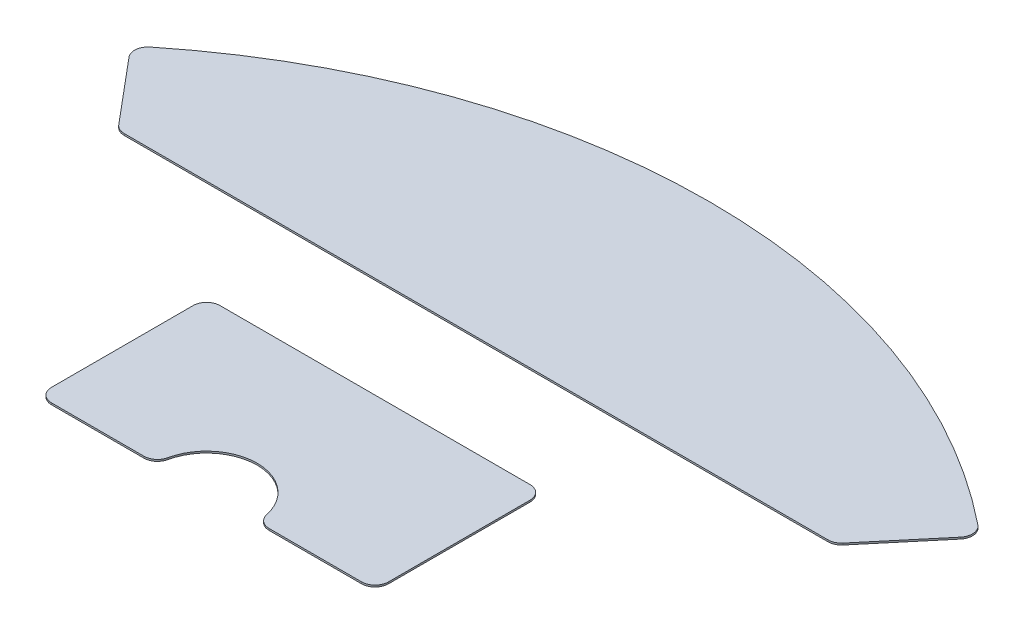
ISO-10303-21;
HEADER;
FILE_DESCRIPTION(('STEP AP214'),'2;1');
FILE_NAME('part.step','',(''),(''),'','','');
FILE_SCHEMA(('AUTOMOTIVE_DESIGN { 1 0 10303 214 1 1 1 1 }'));
ENDSEC;
DATA;
#1=APPLICATION_CONTEXT('core data for automotive mechanical design processes');
#2=APPLICATION_PROTOCOL_DEFINITION('international standard','automotive_design',2000,#1);
#3=PRODUCT_CONTEXT('',#1,'mechanical');
#4=PRODUCT('Part','Part','',(#3));
#5=PRODUCT_RELATED_PRODUCT_CATEGORY('part','',(#4));
#6=PRODUCT_DEFINITION_FORMATION('','',#4);
#7=PRODUCT_DEFINITION_CONTEXT('part definition',#1,'design');
#8=PRODUCT_DEFINITION('design','',#6,#7);
#9=PRODUCT_DEFINITION_SHAPE('','',#8);
#10=(LENGTH_UNIT() NAMED_UNIT(*) SI_UNIT(.MILLI.,.METRE.));
#11=(NAMED_UNIT(*) PLANE_ANGLE_UNIT() SI_UNIT($,.RADIAN.));
#12=(NAMED_UNIT(*) SI_UNIT($,.STERADIAN.) SOLID_ANGLE_UNIT());
#13=UNCERTAINTY_MEASURE_WITH_UNIT(LENGTH_MEASURE(1.E-05),#10,'distance_accuracy_value','');
#14=(GEOMETRIC_REPRESENTATION_CONTEXT(3) GLOBAL_UNCERTAINTY_ASSIGNED_CONTEXT((#13)) GLOBAL_UNIT_ASSIGNED_CONTEXT((#10,
#11,#12)) REPRESENTATION_CONTEXT('',''));
#15=CARTESIAN_POINT('',(0.,0.,0.));
#16=DIRECTION('',(0.,0.,1.));
#17=DIRECTION('',(1.,0.,0.));
#18=AXIS2_PLACEMENT_3D('',#15,#16,#17);
#19=CARTESIAN_POINT('',(62.993185749281,0.254,-51.7364980227537));
#20=DIRECTION('',(-0.766044443118977,0.,-0.642787609686541));
#21=DIRECTION('',(-0.642787609686541,0.,0.766044443118977));
#22=AXIS2_PLACEMENT_3D('',#19,#20,#21);
#23=PLANE('',#22);
#24=DIRECTION('',(0.642787609686541,0.,-0.766044443118977));
#25=VECTOR('',#24,1.);
#26=CARTESIAN_POINT('',(62.993185749281,0.,-51.7364980227537));
#27=LINE('',#26,#25);
#28=CARTESIAN_POINT('',(53.7445681570035,0.,-40.7144247806269));
#29=VERTEX_POINT('',#28);
#30=CARTESIAN_POINT('',(61.6942176679965,0.,-50.1884481452177));
#31=VERTEX_POINT('',#30);
#32=EDGE_CURVE('E168',#29,#31,#27,.T.);
#33=ORIENTED_EDGE('',*,*,#32,.T.);
#34=DIRECTION('',(0.,-1.,0.));
#35=VECTOR('',#34,1.);
#36=CARTESIAN_POINT('',(61.6942176679965,0.254,-50.1884481452177));
#37=LINE('',#36,#35);
#38=CARTESIAN_POINT('',(61.6942176679965,0.254,-50.1884481452177));
#39=VERTEX_POINT('',#38);
#40=EDGE_CURVE('E12',#31,#39,#37,.F.);
#41=ORIENTED_EDGE('',*,*,#40,.T.);
#42=DIRECTION('',(0.642787609686541,0.,-0.766044443118977));
#43=VECTOR('',#42,1.);
#44=CARTESIAN_POINT('',(62.993185749281,0.254,-51.7364980227537));
#45=LINE('',#44,#43);
#46=CARTESIAN_POINT('',(53.7445681570035,0.254,-40.7144247806269));
#47=VERTEX_POINT('',#46);
#48=EDGE_CURVE('E136',#47,#39,#45,.T.);
#49=ORIENTED_EDGE('',*,*,#48,.F.);
#50=DIRECTION('',(0.,-1.,0.));
#51=VECTOR('',#50,1.);
#52=CARTESIAN_POINT('',(53.7445681570035,0.254,-40.7144247806269));
#53=LINE('',#52,#51);
#54=EDGE_CURVE('E52',#47,#29,#53,.T.);
#55=ORIENTED_EDGE('',*,*,#54,.T.);
#56=EDGE_LOOP('',(#33,#41,#49,#55));
#57=FACE_BOUND('',#56,.T.);
#58=ADVANCED_FACE('F44',(#57),#23,.F.);
#59=CARTESIAN_POINT('',(0.,0.254,23.335857402906));
#60=DIRECTION('',(0.,-1.,0.));
#61=DIRECTION('',(0.,0.,-1.));
#62=AXIS2_PLACEMENT_3D('',#59,#60,#61);
#63=CYLINDRICAL_SURFACE('',#62,98.);
#64=CARTESIAN_POINT('',(0.,0.,23.335857402906));
#65=DIRECTION('',(0.,1.,0.));
#66=DIRECTION('',(0.,0.,-1.));
#67=AXIS2_PLACEMENT_3D('',#64,#65,#66);
#68=CIRCLE('',#67,98.);
#69=CARTESIAN_POINT('',(61.4155064647119,0.,-53.0325625472469));
#70=VERTEX_POINT('',#69);
#71=CARTESIAN_POINT('',(-61.4155064647119,0.,-53.032562547247));
#72=VERTEX_POINT('',#71);
#73=EDGE_CURVE('E141',#70,#72,#68,.T.);
#74=ORIENTED_EDGE('',*,*,#73,.T.);
#75=DIRECTION('',(0.,-1.,0.));
#76=VECTOR('',#75,1.);
#77=CARTESIAN_POINT('',(-61.4155064647119,0.254,-53.032562547247));
#78=LINE('',#77,#76);
#79=CARTESIAN_POINT('',(-61.4155064647119,0.254,-53.032562547247));
#80=VERTEX_POINT('',#79);
#81=EDGE_CURVE('E59',#72,#80,#78,.F.);
#82=ORIENTED_EDGE('',*,*,#81,.T.);
#83=CARTESIAN_POINT('',(0.,0.254,23.335857402906));
#84=DIRECTION('',(0.,1.,0.));
#85=DIRECTION('',(0.,0.,-1.));
#86=AXIS2_PLACEMENT_3D('',#83,#84,#85);
#87=CIRCLE('',#86,98.);
#88=CARTESIAN_POINT('',(61.4155064647119,0.254,-53.0325625472469));
#89=VERTEX_POINT('',#88);
#90=EDGE_CURVE('E139',#89,#80,#87,.T.);
#91=ORIENTED_EDGE('',*,*,#90,.F.);
#92=DIRECTION('',(0.,-1.,0.));
#93=VECTOR('',#92,1.);
#94=CARTESIAN_POINT('',(61.4155064647119,0.254,-53.0325625472469));
#95=LINE('',#94,#93);
#96=EDGE_CURVE('E160',#89,#70,#95,.T.);
#97=ORIENTED_EDGE('',*,*,#96,.T.);
#98=EDGE_LOOP('',(#74,#82,#91,#97));
#99=FACE_BOUND('',#98,.T.);
#100=ADVANCED_FACE('F188',(#99),#63,.T.);
#101=CARTESIAN_POINT('',(-53.1450945870755,0.254,-40.));
#102=DIRECTION('',(0.766044443118977,0.,-0.64278760968654));
#103=DIRECTION('',(-0.64278760968654,0.,-0.766044443118977));
#104=AXIS2_PLACEMENT_3D('',#101,#102,#103);
#105=PLANE('',#104);
#106=DIRECTION('',(0.64278760968654,0.,0.766044443118977));
#107=VECTOR('',#106,1.);
#108=CARTESIAN_POINT('',(-53.1450945870755,0.,-40.));
#109=LINE('',#108,#107);
#110=CARTESIAN_POINT('',(-61.6942176679966,0.,-50.1884481452177));
#111=VERTEX_POINT('',#110);
#112=CARTESIAN_POINT('',(-53.7445681570035,0.,-40.7144247806269));
#113=VERTEX_POINT('',#112);
#114=EDGE_CURVE('E137',#111,#113,#109,.T.);
#115=ORIENTED_EDGE('',*,*,#114,.T.);
#116=DIRECTION('',(0.,-1.,0.));
#117=VECTOR('',#116,1.);
#118=CARTESIAN_POINT('',(-53.7445681570035,0.254,-40.7144247806269));
#119=LINE('',#118,#117);
#120=CARTESIAN_POINT('',(-53.7445681570035,0.254,-40.7144247806269));
#121=VERTEX_POINT('',#120);
#122=EDGE_CURVE('E115',#113,#121,#119,.F.);
#123=ORIENTED_EDGE('',*,*,#122,.T.);
#124=DIRECTION('',(0.64278760968654,0.,0.766044443118977));
#125=VECTOR('',#124,1.);
#126=CARTESIAN_POINT('',(-53.1450945870755,0.254,-40.));
#127=LINE('',#126,#125);
#128=CARTESIAN_POINT('',(-61.6942176679966,0.254,-50.1884481452177));
#129=VERTEX_POINT('',#128);
#130=EDGE_CURVE('E176',#129,#121,#127,.T.);
#131=ORIENTED_EDGE('',*,*,#130,.F.);
#132=DIRECTION('',(0.,-1.,0.));
#133=VECTOR('',#132,1.);
#134=CARTESIAN_POINT('',(-61.6942176679966,0.254,-50.1884481452177));
#135=LINE('',#134,#133);
#136=EDGE_CURVE('E120',#129,#111,#135,.T.);
#137=ORIENTED_EDGE('',*,*,#136,.T.);
#138=EDGE_LOOP('',(#115,#123,#131,#137));
#139=FACE_BOUND('',#138,.T.);
#140=ADVANCED_FACE('F187',(#139),#105,.F.);
#141=CARTESIAN_POINT('',(53.1450945870755,0.254,-40.));
#142=DIRECTION('',(0.,0.,-1.));
#143=DIRECTION('',(-1.,0.,0.));
#144=AXIS2_PLACEMENT_3D('',#141,#142,#143);
#145=PLANE('',#144);
#146=DIRECTION('',(1.,0.,0.));
#147=VECTOR('',#146,1.);
#148=CARTESIAN_POINT('',(53.1450945870755,0.254,-40.));
#149=LINE('',#148,#147);
#150=CARTESIAN_POINT('',(-52.2124792707655,0.254,-40.));
#151=VERTEX_POINT('',#150);
#152=CARTESIAN_POINT('',(52.2124792707655,0.254,-40.));
#153=VERTEX_POINT('',#152);
#154=EDGE_CURVE('E130',#151,#153,#149,.T.);
#155=ORIENTED_EDGE('',*,*,#154,.F.);
#156=DIRECTION('',(0.,-1.,0.));
#157=VECTOR('',#156,1.);
#158=CARTESIAN_POINT('',(-52.2124792707655,0.254,-40.));
#159=LINE('',#158,#157);
#160=CARTESIAN_POINT('',(-52.2124792707655,0.,-40.));
#161=VERTEX_POINT('',#160);
#162=EDGE_CURVE('E114',#151,#161,#159,.T.);
#163=ORIENTED_EDGE('',*,*,#162,.T.);
#164=DIRECTION('',(1.,0.,0.));
#165=VECTOR('',#164,1.);
#166=CARTESIAN_POINT('',(53.1450945870755,0.,-40.));
#167=LINE('',#166,#165);
#168=CARTESIAN_POINT('',(52.2124792707655,0.,-40.));
#169=VERTEX_POINT('',#168);
#170=EDGE_CURVE('E127',#161,#169,#167,.T.);
#171=ORIENTED_EDGE('',*,*,#170,.T.);
#172=DIRECTION('',(0.,-1.,0.));
#173=VECTOR('',#172,1.);
#174=CARTESIAN_POINT('',(52.2124792707655,0.254,-40.));
#175=LINE('',#174,#173);
#176=EDGE_CURVE('E132',#169,#153,#175,.F.);
#177=ORIENTED_EDGE('',*,*,#176,.T.);
#178=EDGE_LOOP('',(#155,#163,#171,#177));
#179=FACE_BOUND('',#178,.T.);
#180=ADVANCED_FACE('F126',(#179),#145,.F.);
#181=CARTESIAN_POINT('',(0.,0.254,23.335857402906));
#182=DIRECTION('',(0.,-1.,0.));
#183=DIRECTION('',(0.,0.,-1.));
#184=AXIS2_PLACEMENT_3D('',#181,#182,#183);
#185=PLANE('',#184);
#186=ORIENTED_EDGE('',*,*,#130,.T.);
#187=CARTESIAN_POINT('',(-52.2124792707655,0.254,-42.));
#188=DIRECTION('',(0.,-1.,0.));
#189=DIRECTION('',(0.,0.,-1.));
#190=AXIS2_PLACEMENT_3D('',#187,#188,#189);
#191=CIRCLE('',#190,2.);
#192=EDGE_CURVE('E158',#121,#151,#191,.F.);
#193=ORIENTED_EDGE('',*,*,#192,.T.);
#194=ORIENTED_EDGE('',*,*,#154,.T.);
#195=CARTESIAN_POINT('',(52.2124792707655,0.254,-42.));
#196=DIRECTION('',(0.,-1.,0.));
#197=DIRECTION('',(0.,0.,-1.));
#198=AXIS2_PLACEMENT_3D('',#195,#196,#197);
#199=CIRCLE('',#198,2.);
#200=EDGE_CURVE('E153',#153,#47,#199,.F.);
#201=ORIENTED_EDGE('',*,*,#200,.T.);
#202=ORIENTED_EDGE('',*,*,#48,.T.);
#203=CARTESIAN_POINT('',(60.1621287817586,0.254,-51.4740233645907));
#204=DIRECTION('',(0.,-1.,0.));
#205=DIRECTION('',(0.,0.,-1.));
#206=AXIS2_PLACEMENT_3D('',#203,#204,#205);
#207=CIRCLE('',#206,2.);
#208=EDGE_CURVE('E66',#39,#89,#207,.F.);
#209=ORIENTED_EDGE('',*,*,#208,.T.);
#210=ORIENTED_EDGE('',*,*,#90,.T.);
#211=CARTESIAN_POINT('',(-60.1621287817586,0.254,-51.4740233645908));
#212=DIRECTION('',(0.,-1.,0.));
#213=DIRECTION('',(0.,0.,-1.));
#214=AXIS2_PLACEMENT_3D('',#211,#212,#213);
#215=CIRCLE('',#214,2.);
#216=EDGE_CURVE('E156',#80,#129,#215,.F.);
#217=ORIENTED_EDGE('',*,*,#216,.T.);
#218=EDGE_LOOP('',(#186,#193,#194,#201,#202,#209,#210,#217));
#219=FACE_BOUND('',#218,.T.);
#220=ADVANCED_FACE('F180',(#219),#185,.F.);
#221=CARTESIAN_POINT('',(0.,0.,23.335857402906));
#222=DIRECTION('',(0.,-1.,0.));
#223=DIRECTION('',(0.,0.,-1.));
#224=AXIS2_PLACEMENT_3D('',#221,#222,#223);
#225=PLANE('',#224);
#226=ORIENTED_EDGE('',*,*,#170,.F.);
#227=CARTESIAN_POINT('',(-52.2124792707655,0.,-42.));
#228=DIRECTION('',(0.,-1.,0.));
#229=DIRECTION('',(0.,0.,-1.));
#230=AXIS2_PLACEMENT_3D('',#227,#228,#229);
#231=CIRCLE('',#230,2.);
#232=EDGE_CURVE('E110',#161,#113,#231,.T.);
#233=ORIENTED_EDGE('',*,*,#232,.T.);
#234=ORIENTED_EDGE('',*,*,#114,.F.);
#235=CARTESIAN_POINT('',(-60.1621287817586,0.,-51.4740233645908));
#236=DIRECTION('',(0.,-1.,0.));
#237=DIRECTION('',(0.,0.,-1.));
#238=AXIS2_PLACEMENT_3D('',#235,#236,#237);
#239=CIRCLE('',#238,2.);
#240=EDGE_CURVE('E121',#111,#72,#239,.T.);
#241=ORIENTED_EDGE('',*,*,#240,.T.);
#242=ORIENTED_EDGE('',*,*,#73,.F.);
#243=CARTESIAN_POINT('',(60.1621287817586,0.,-51.4740233645907));
#244=DIRECTION('',(0.,-1.,0.));
#245=DIRECTION('',(0.,0.,-1.));
#246=AXIS2_PLACEMENT_3D('',#243,#244,#245);
#247=CIRCLE('',#246,2.);
#248=EDGE_CURVE('E147',#70,#31,#247,.T.);
#249=ORIENTED_EDGE('',*,*,#248,.T.);
#250=ORIENTED_EDGE('',*,*,#32,.F.);
#251=CARTESIAN_POINT('',(52.2124792707655,0.,-42.));
#252=DIRECTION('',(0.,-1.,0.));
#253=DIRECTION('',(0.,0.,-1.));
#254=AXIS2_PLACEMENT_3D('',#251,#252,#253);
#255=CIRCLE('',#254,2.);
#256=EDGE_CURVE('E131',#29,#169,#255,.T.);
#257=ORIENTED_EDGE('',*,*,#256,.T.);
#258=EDGE_LOOP('',(#226,#233,#234,#241,#242,#249,#250,#257));
#259=FACE_BOUND('',#258,.T.);
#260=ADVANCED_FACE('F134',(#259),#225,.T.);
#261=CARTESIAN_POINT('',(-52.2124792707655,0.254,-42.));
#262=DIRECTION('',(0.,-1.,0.));
#263=DIRECTION('',(0.,0.,-1.));
#264=AXIS2_PLACEMENT_3D('',#261,#262,#263);
#265=CYLINDRICAL_SURFACE('',#264,2.);
#266=ORIENTED_EDGE('',*,*,#192,.F.);
#267=ORIENTED_EDGE('',*,*,#122,.F.);
#268=ORIENTED_EDGE('',*,*,#232,.F.);
#269=ORIENTED_EDGE('',*,*,#162,.F.);
#270=EDGE_LOOP('',(#266,#267,#268,#269));
#271=FACE_BOUND('',#270,.T.);
#272=ADVANCED_FACE('F113',(#271),#265,.T.);
#273=CARTESIAN_POINT('',(-60.1621287817586,0.254,-51.4740233645908));
#274=DIRECTION('',(0.,-1.,0.));
#275=DIRECTION('',(0.,0.,-1.));
#276=AXIS2_PLACEMENT_3D('',#273,#274,#275);
#277=CYLINDRICAL_SURFACE('',#276,2.);
#278=ORIENTED_EDGE('',*,*,#216,.F.);
#279=ORIENTED_EDGE('',*,*,#81,.F.);
#280=ORIENTED_EDGE('',*,*,#240,.F.);
#281=ORIENTED_EDGE('',*,*,#136,.F.);
#282=EDGE_LOOP('',(#278,#279,#280,#281));
#283=FACE_BOUND('',#282,.T.);
#284=ADVANCED_FACE('F185',(#283),#277,.T.);
#285=CARTESIAN_POINT('',(60.1621287817586,0.254,-51.4740233645907));
#286=DIRECTION('',(0.,-1.,0.));
#287=DIRECTION('',(0.,0.,-1.));
#288=AXIS2_PLACEMENT_3D('',#285,#286,#287);
#289=CYLINDRICAL_SURFACE('',#288,2.);
#290=ORIENTED_EDGE('',*,*,#208,.F.);
#291=ORIENTED_EDGE('',*,*,#40,.F.);
#292=ORIENTED_EDGE('',*,*,#248,.F.);
#293=ORIENTED_EDGE('',*,*,#96,.F.);
#294=EDGE_LOOP('',(#290,#291,#292,#293));
#295=FACE_BOUND('',#294,.T.);
#296=ADVANCED_FACE('F190',(#295),#289,.T.);
#297=CARTESIAN_POINT('',(52.2124792707655,0.254,-42.));
#298=DIRECTION('',(0.,-1.,0.));
#299=DIRECTION('',(0.,0.,-1.));
#300=AXIS2_PLACEMENT_3D('',#297,#298,#299);
#301=CYLINDRICAL_SURFACE('',#300,2.);
#302=ORIENTED_EDGE('',*,*,#200,.F.);
#303=ORIENTED_EDGE('',*,*,#176,.F.);
#304=ORIENTED_EDGE('',*,*,#256,.F.);
#305=ORIENTED_EDGE('',*,*,#54,.F.);
#306=EDGE_LOOP('',(#302,#303,#304,#305));
#307=FACE_BOUND('',#306,.T.);
#308=ADVANCED_FACE('F46',(#307),#301,.T.);
#309=CLOSED_SHELL('',(#58,#100,#140,#180,#220,#260,#272,#284,#296,#308));
#310=MANIFOLD_SOLID_BREP('B2',#309);
#311=CARTESIAN_POINT('',(0.,0.254,0.));
#312=DIRECTION('',(0.,-1.,0.));
#313=DIRECTION('',(0.,0.,-1.));
#314=AXIS2_PLACEMENT_3D('',#311,#312,#313);
#315=CYLINDRICAL_SURFACE('',#314,7.5);
#316=CARTESIAN_POINT('',(0.,0.254,0.));
#317=DIRECTION('',(0.,-1.,0.));
#318=DIRECTION('',(0.,0.,1.));
#319=AXIS2_PLACEMENT_3D('',#316,#317,#318);
#320=CIRCLE('',#319,7.5);
#321=CARTESIAN_POINT('',(-7.33191142934475,0.254,-1.57894736842105));
#322=VERTEX_POINT('',#321);
#323=CARTESIAN_POINT('',(7.33191142934475,0.254,-1.57894736842105));
#324=VERTEX_POINT('',#323);
#325=EDGE_CURVE('E381',#322,#324,#320,.T.);
#326=ORIENTED_EDGE('',*,*,#325,.F.);
#327=DIRECTION('',(0.,-1.,0.));
#328=VECTOR('',#327,1.);
#329=CARTESIAN_POINT('',(-7.33191142934476,0.254,-1.57894736842105));
#330=LINE('',#329,#328);
#331=CARTESIAN_POINT('',(-7.33191142934475,0.,-1.57894736842105));
#332=VERTEX_POINT('',#331);
#333=EDGE_CURVE('E366',#322,#332,#330,.T.);
#334=ORIENTED_EDGE('',*,*,#333,.T.);
#335=CARTESIAN_POINT('',(0.,0.,0.));
#336=DIRECTION('',(0.,-1.,0.));
#337=DIRECTION('',(0.,0.,1.));
#338=AXIS2_PLACEMENT_3D('',#335,#336,#337);
#339=CIRCLE('',#338,7.5);
#340=CARTESIAN_POINT('',(7.33191142934475,0.,-1.57894736842105));
#341=VERTEX_POINT('',#340);
#342=EDGE_CURVE('E378',#332,#341,#339,.T.);
#343=ORIENTED_EDGE('',*,*,#342,.T.);
#344=DIRECTION('',(0.,-1.,0.));
#345=VECTOR('',#344,1.);
#346=CARTESIAN_POINT('',(7.33191142934476,0.254,-1.57894736842105));
#347=LINE('',#346,#345);
#348=EDGE_CURVE('E383',#341,#324,#347,.F.);
#349=ORIENTED_EDGE('',*,*,#348,.T.);
#350=EDGE_LOOP('',(#326,#334,#343,#349));
#351=FACE_BOUND('',#350,.T.);
#352=ADVANCED_FACE('F271',(#351),#315,.F.);
#353=CARTESIAN_POINT('',(25.,0.254,0.));
#354=DIRECTION('',(0.,0.,-1.));
#355=DIRECTION('',(-1.,0.,0.));
#356=AXIS2_PLACEMENT_3D('',#353,#354,#355);
#357=PLANE('',#356);
#358=DIRECTION('',(1.,0.,0.));
#359=VECTOR('',#358,1.);
#360=CARTESIAN_POINT('',(25.,0.254,0.));
#361=LINE('',#360,#359);
#362=CARTESIAN_POINT('',(9.28708781050335,0.254,0.));
#363=VERTEX_POINT('',#362);
#364=CARTESIAN_POINT('',(23.,0.254,0.));
#365=VERTEX_POINT('',#364);
#366=EDGE_CURVE('E446',#363,#365,#361,.T.);
#367=ORIENTED_EDGE('',*,*,#366,.F.);
#368=DIRECTION('',(0.,-1.,0.));
#369=VECTOR('',#368,1.);
#370=CARTESIAN_POINT('',(9.28708781050335,0.254,0.));
#371=LINE('',#370,#369);
#372=CARTESIAN_POINT('',(9.28708781050335,0.,0.));
#373=VERTEX_POINT('',#372);
#374=EDGE_CURVE('E42',#363,#373,#371,.T.);
#375=ORIENTED_EDGE('',*,*,#374,.T.);
#376=DIRECTION('',(1.,0.,0.));
#377=VECTOR('',#376,1.);
#378=CARTESIAN_POINT('',(25.,0.,0.));
#379=LINE('',#378,#377);
#380=CARTESIAN_POINT('',(23.,0.,0.));
#381=VERTEX_POINT('',#380);
#382=EDGE_CURVE('E388',#373,#381,#379,.T.);
#383=ORIENTED_EDGE('',*,*,#382,.T.);
#384=DIRECTION('',(0.,-1.,0.));
#385=VECTOR('',#384,1.);
#386=CARTESIAN_POINT('',(23.,0.254,0.));
#387=LINE('',#386,#385);
#388=EDGE_CURVE('E279',#381,#365,#387,.F.);
#389=ORIENTED_EDGE('',*,*,#388,.T.);
#390=EDGE_LOOP('',(#367,#375,#383,#389));
#391=FACE_BOUND('',#390,.T.);
#392=ADVANCED_FACE('F445',(#391),#357,.F.);
#393=CARTESIAN_POINT('',(25.,0.254,-25.));
#394=DIRECTION('',(-1.,0.,0.));
#395=DIRECTION('',(0.,0.,1.));
#396=AXIS2_PLACEMENT_3D('',#393,#394,#395);
#397=PLANE('',#396);
#398=DIRECTION('',(0.,0.,-1.));
#399=VECTOR('',#398,1.);
#400=CARTESIAN_POINT('',(25.,0.,-25.));
#401=LINE('',#400,#399);
#402=CARTESIAN_POINT('',(25.,0.,-2.));
#403=VERTEX_POINT('',#402);
#404=CARTESIAN_POINT('',(25.,0.,-23.));
#405=VERTEX_POINT('',#404);
#406=EDGE_CURVE('E391',#403,#405,#401,.T.);
#407=ORIENTED_EDGE('',*,*,#406,.T.);
#408=DIRECTION('',(0.,-1.,0.));
#409=VECTOR('',#408,1.);
#410=CARTESIAN_POINT('',(25.,0.254,-23.));
#411=LINE('',#410,#409);
#412=CARTESIAN_POINT('',(25.,0.254,-23.));
#413=VERTEX_POINT('',#412);
#414=EDGE_CURVE('E440',#405,#413,#411,.F.);
#415=ORIENTED_EDGE('',*,*,#414,.T.);
#416=DIRECTION('',(0.,0.,-1.));
#417=VECTOR('',#416,1.);
#418=CARTESIAN_POINT('',(25.,0.254,-25.));
#419=LINE('',#418,#417);
#420=CARTESIAN_POINT('',(25.,0.254,-2.));
#421=VERTEX_POINT('',#420);
#422=EDGE_CURVE('E455',#421,#413,#419,.T.);
#423=ORIENTED_EDGE('',*,*,#422,.F.);
#424=DIRECTION('',(0.,-1.,0.));
#425=VECTOR('',#424,1.);
#426=CARTESIAN_POINT('',(25.,0.254,-2.));
#427=LINE('',#426,#425);
#428=EDGE_CURVE('E437',#421,#403,#427,.T.);
#429=ORIENTED_EDGE('',*,*,#428,.T.);
#430=EDGE_LOOP('',(#407,#415,#423,#429));
#431=FACE_BOUND('',#430,.T.);
#432=ADVANCED_FACE('F460',(#431),#397,.F.);
#433=CARTESIAN_POINT('',(-25.,0.254,-25.));
#434=DIRECTION('',(0.,0.,1.));
#435=DIRECTION('',(1.,0.,0.));
#436=AXIS2_PLACEMENT_3D('',#433,#434,#435);
#437=PLANE('',#436);
#438=DIRECTION('',(-1.,0.,0.));
#439=VECTOR('',#438,1.);
#440=CARTESIAN_POINT('',(-25.,0.,-25.));
#441=LINE('',#440,#439);
#442=CARTESIAN_POINT('',(23.,0.,-25.));
#443=VERTEX_POINT('',#442);
#444=CARTESIAN_POINT('',(-23.,0.,-25.));
#445=VERTEX_POINT('',#444);
#446=EDGE_CURVE('E399',#443,#445,#441,.T.);
#447=ORIENTED_EDGE('',*,*,#446,.T.);
#448=DIRECTION('',(0.,-1.,0.));
#449=VECTOR('',#448,1.);
#450=CARTESIAN_POINT('',(-23.,0.254,-25.));
#451=LINE('',#450,#449);
#452=CARTESIAN_POINT('',(-23.,0.254,-25.));
#453=VERTEX_POINT('',#452);
#454=EDGE_CURVE('E435',#445,#453,#451,.F.);
#455=ORIENTED_EDGE('',*,*,#454,.T.);
#456=DIRECTION('',(-1.,0.,0.));
#457=VECTOR('',#456,1.);
#458=CARTESIAN_POINT('',(-25.,0.254,-25.));
#459=LINE('',#458,#457);
#460=CARTESIAN_POINT('',(23.,0.254,-25.));
#461=VERTEX_POINT('',#460);
#462=EDGE_CURVE('E471',#461,#453,#459,.T.);
#463=ORIENTED_EDGE('',*,*,#462,.F.);
#464=DIRECTION('',(0.,-1.,0.));
#465=VECTOR('',#464,1.);
#466=CARTESIAN_POINT('',(23.,0.254,-25.));
#467=LINE('',#466,#465);
#468=EDGE_CURVE('E432',#461,#443,#467,.T.);
#469=ORIENTED_EDGE('',*,*,#468,.T.);
#470=EDGE_LOOP('',(#447,#455,#463,#469));
#471=FACE_BOUND('',#470,.T.);
#472=ADVANCED_FACE('F469',(#471),#437,.F.);
#473=CARTESIAN_POINT('',(-25.,0.254,0.));
#474=DIRECTION('',(1.,0.,0.));
#475=DIRECTION('',(0.,0.,-1.));
#476=AXIS2_PLACEMENT_3D('',#473,#474,#475);
#477=PLANE('',#476);
#478=DIRECTION('',(0.,0.,1.));
#479=VECTOR('',#478,1.);
#480=CARTESIAN_POINT('',(-25.,0.,0.));
#481=LINE('',#480,#479);
#482=CARTESIAN_POINT('',(-25.,0.,-23.));
#483=VERTEX_POINT('',#482);
#484=CARTESIAN_POINT('',(-25.,0.,-2.));
#485=VERTEX_POINT('',#484);
#486=EDGE_CURVE('E402',#483,#485,#481,.T.);
#487=ORIENTED_EDGE('',*,*,#486,.T.);
#488=DIRECTION('',(0.,-1.,0.));
#489=VECTOR('',#488,1.);
#490=CARTESIAN_POINT('',(-25.,0.254,-2.));
#491=LINE('',#490,#489);
#492=CARTESIAN_POINT('',(-25.,0.254,-2.));
#493=VERTEX_POINT('',#492);
#494=EDGE_CURVE('E286',#485,#493,#491,.F.);
#495=ORIENTED_EDGE('',*,*,#494,.T.);
#496=DIRECTION('',(0.,0.,1.));
#497=VECTOR('',#496,1.);
#498=CARTESIAN_POINT('',(-25.,0.254,0.));
#499=LINE('',#498,#497);
#500=CARTESIAN_POINT('',(-25.,0.254,-23.));
#501=VERTEX_POINT('',#500);
#502=EDGE_CURVE('E472',#501,#493,#499,.T.);
#503=ORIENTED_EDGE('',*,*,#502,.F.);
#504=DIRECTION('',(0.,-1.,0.));
#505=VECTOR('',#504,1.);
#506=CARTESIAN_POINT('',(-25.,0.254,-23.));
#507=LINE('',#506,#505);
#508=EDGE_CURVE('E428',#501,#483,#507,.T.);
#509=ORIENTED_EDGE('',*,*,#508,.T.);
#510=EDGE_LOOP('',(#487,#495,#503,#509));
#511=FACE_BOUND('',#510,.T.);
#512=ADVANCED_FACE('F505',(#511),#477,.F.);
#513=CARTESIAN_POINT('',(-7.5,0.254,0.));
#514=DIRECTION('',(0.,0.,-1.));
#515=DIRECTION('',(-1.,0.,0.));
#516=AXIS2_PLACEMENT_3D('',#513,#514,#515);
#517=PLANE('',#516);
#518=DIRECTION('',(1.,0.,0.));
#519=VECTOR('',#518,1.);
#520=CARTESIAN_POINT('',(-7.5,0.,0.));
#521=LINE('',#520,#519);
#522=CARTESIAN_POINT('',(-23.,0.,0.));
#523=VERTEX_POINT('',#522);
#524=CARTESIAN_POINT('',(-9.28708781050335,0.,0.));
#525=VERTEX_POINT('',#524);
#526=EDGE_CURVE('E404',#523,#525,#521,.T.);
#527=ORIENTED_EDGE('',*,*,#526,.T.);
#528=DIRECTION('',(0.,-1.,0.));
#529=VECTOR('',#528,1.);
#530=CARTESIAN_POINT('',(-9.28708781050335,0.254,0.));
#531=LINE('',#530,#529);
#532=CARTESIAN_POINT('',(-9.28708781050335,0.254,0.));
#533=VERTEX_POINT('',#532);
#534=EDGE_CURVE('E367',#525,#533,#531,.F.);
#535=ORIENTED_EDGE('',*,*,#534,.T.);
#536=DIRECTION('',(1.,0.,0.));
#537=VECTOR('',#536,1.);
#538=CARTESIAN_POINT('',(-7.5,0.254,0.));
#539=LINE('',#538,#537);
#540=CARTESIAN_POINT('',(-23.,0.254,0.));
#541=VERTEX_POINT('',#540);
#542=EDGE_CURVE('E394',#541,#533,#539,.T.);
#543=ORIENTED_EDGE('',*,*,#542,.F.);
#544=DIRECTION('',(0.,-1.,0.));
#545=VECTOR('',#544,1.);
#546=CARTESIAN_POINT('',(-23.,0.254,0.));
#547=LINE('',#546,#545);
#548=EDGE_CURVE('E372',#541,#523,#547,.T.);
#549=ORIENTED_EDGE('',*,*,#548,.T.);
#550=EDGE_LOOP('',(#527,#535,#543,#549));
#551=FACE_BOUND('',#550,.T.);
#552=ADVANCED_FACE('F510',(#551),#517,.F.);
#553=CARTESIAN_POINT('',(0.,0.254,0.));
#554=DIRECTION('',(0.,1.,0.));
#555=DIRECTION('',(0.,0.,1.));
#556=AXIS2_PLACEMENT_3D('',#553,#554,#555);
#557=PLANE('',#556);
#558=ORIENTED_EDGE('',*,*,#542,.T.);
#559=CARTESIAN_POINT('',(-9.28708781050335,0.254,-2.));
#560=DIRECTION('',(0.,1.,0.));
#561=DIRECTION('',(0.,0.,1.));
#562=AXIS2_PLACEMENT_3D('',#559,#560,#561);
#563=CIRCLE('',#562,2.);
#564=EDGE_CURVE('E426',#533,#322,#563,.T.);
#565=ORIENTED_EDGE('',*,*,#564,.T.);
#566=ORIENTED_EDGE('',*,*,#325,.T.);
#567=CARTESIAN_POINT('',(9.28708781050335,0.254,-2.));
#568=DIRECTION('',(0.,1.,0.));
#569=DIRECTION('',(0.,0.,1.));
#570=AXIS2_PLACEMENT_3D('',#567,#568,#569);
#571=CIRCLE('',#570,2.);
#572=EDGE_CURVE('E419',#324,#363,#571,.T.);
#573=ORIENTED_EDGE('',*,*,#572,.T.);
#574=ORIENTED_EDGE('',*,*,#366,.T.);
#575=CARTESIAN_POINT('',(23.,0.254,-2.));
#576=DIRECTION('',(0.,1.,0.));
#577=DIRECTION('',(0.,0.,1.));
#578=AXIS2_PLACEMENT_3D('',#575,#576,#577);
#579=CIRCLE('',#578,2.);
#580=EDGE_CURVE('E417',#365,#421,#579,.T.);
#581=ORIENTED_EDGE('',*,*,#580,.T.);
#582=ORIENTED_EDGE('',*,*,#422,.T.);
#583=CARTESIAN_POINT('',(23.,0.254,-23.));
#584=DIRECTION('',(0.,1.,0.));
#585=DIRECTION('',(0.,0.,1.));
#586=AXIS2_PLACEMENT_3D('',#583,#584,#585);
#587=CIRCLE('',#586,2.);
#588=EDGE_CURVE('E421',#413,#461,#587,.T.);
#589=ORIENTED_EDGE('',*,*,#588,.T.);
#590=ORIENTED_EDGE('',*,*,#462,.T.);
#591=CARTESIAN_POINT('',(-23.,0.254,-23.));
#592=DIRECTION('',(0.,1.,0.));
#593=DIRECTION('',(0.,0.,1.));
#594=AXIS2_PLACEMENT_3D('',#591,#592,#593);
#595=CIRCLE('',#594,2.);
#596=EDGE_CURVE('E293',#453,#501,#595,.T.);
#597=ORIENTED_EDGE('',*,*,#596,.T.);
#598=ORIENTED_EDGE('',*,*,#502,.T.);
#599=CARTESIAN_POINT('',(-23.,0.254,-2.));
#600=DIRECTION('',(0.,1.,0.));
#601=DIRECTION('',(0.,0.,1.));
#602=AXIS2_PLACEMENT_3D('',#599,#600,#601);
#603=CIRCLE('',#602,2.);
#604=EDGE_CURVE('E424',#493,#541,#603,.T.);
#605=ORIENTED_EDGE('',*,*,#604,.T.);
#606=EDGE_LOOP('',(#558,#565,#566,#573,#574,#581,#582,#589,#590,#597,#598,#605));
#607=FACE_BOUND('',#606,.T.);
#608=ADVANCED_FACE('F451',(#607),#557,.T.);
#609=CARTESIAN_POINT('',(0.,0.,0.));
#610=DIRECTION('',(0.,1.,0.));
#611=DIRECTION('',(0.,0.,1.));
#612=AXIS2_PLACEMENT_3D('',#609,#610,#611);
#613=PLANE('',#612);
#614=ORIENTED_EDGE('',*,*,#342,.F.);
#615=CARTESIAN_POINT('',(-9.28708781050335,0.,-2.));
#616=DIRECTION('',(0.,1.,0.));
#617=DIRECTION('',(0.,0.,1.));
#618=AXIS2_PLACEMENT_3D('',#615,#616,#617);
#619=CIRCLE('',#618,2.);
#620=EDGE_CURVE('E362',#332,#525,#619,.F.);
#621=ORIENTED_EDGE('',*,*,#620,.T.);
#622=ORIENTED_EDGE('',*,*,#526,.F.);
#623=CARTESIAN_POINT('',(-23.,0.,-2.));
#624=DIRECTION('',(0.,1.,0.));
#625=DIRECTION('',(0.,0.,1.));
#626=AXIS2_PLACEMENT_3D('',#623,#624,#625);
#627=CIRCLE('',#626,2.);
#628=EDGE_CURVE('E373',#523,#485,#627,.F.);
#629=ORIENTED_EDGE('',*,*,#628,.T.);
#630=ORIENTED_EDGE('',*,*,#486,.F.);
#631=CARTESIAN_POINT('',(-23.,0.,-23.));
#632=DIRECTION('',(0.,1.,0.));
#633=DIRECTION('',(0.,0.,1.));
#634=AXIS2_PLACEMENT_3D('',#631,#632,#633);
#635=CIRCLE('',#634,2.);
#636=EDGE_CURVE('E411',#483,#445,#635,.F.);
#637=ORIENTED_EDGE('',*,*,#636,.T.);
#638=ORIENTED_EDGE('',*,*,#446,.F.);
#639=CARTESIAN_POINT('',(23.,0.,-23.));
#640=DIRECTION('',(0.,1.,0.));
#641=DIRECTION('',(0.,0.,1.));
#642=AXIS2_PLACEMENT_3D('',#639,#640,#641);
#643=CIRCLE('',#642,2.);
#644=EDGE_CURVE('E409',#443,#405,#643,.F.);
#645=ORIENTED_EDGE('',*,*,#644,.T.);
#646=ORIENTED_EDGE('',*,*,#406,.F.);
#647=CARTESIAN_POINT('',(23.,0.,-2.));
#648=DIRECTION('',(0.,1.,0.));
#649=DIRECTION('',(0.,0.,1.));
#650=AXIS2_PLACEMENT_3D('',#647,#648,#649);
#651=CIRCLE('',#650,2.);
#652=EDGE_CURVE('E382',#403,#381,#651,.F.);
#653=ORIENTED_EDGE('',*,*,#652,.T.);
#654=ORIENTED_EDGE('',*,*,#382,.F.);
#655=CARTESIAN_POINT('',(9.28708781050335,0.,-2.));
#656=DIRECTION('',(0.,1.,0.));
#657=DIRECTION('',(0.,0.,1.));
#658=AXIS2_PLACEMENT_3D('',#655,#656,#657);
#659=CIRCLE('',#658,2.);
#660=EDGE_CURVE('E387',#373,#341,#659,.F.);
#661=ORIENTED_EDGE('',*,*,#660,.T.);
#662=EDGE_LOOP('',(#614,#621,#622,#629,#630,#637,#638,#645,#646,#653,#654,#661));
#663=FACE_BOUND('',#662,.T.);
#664=ADVANCED_FACE('F385',(#663),#613,.F.);
#665=CARTESIAN_POINT('',(-9.28708781050335,0.254,-2.));
#666=DIRECTION('',(0.,-1.,0.));
#667=DIRECTION('',(0.,0.,-1.));
#668=AXIS2_PLACEMENT_3D('',#665,#666,#667);
#669=CYLINDRICAL_SURFACE('',#668,2.);
#670=ORIENTED_EDGE('',*,*,#564,.F.);
#671=ORIENTED_EDGE('',*,*,#534,.F.);
#672=ORIENTED_EDGE('',*,*,#620,.F.);
#673=ORIENTED_EDGE('',*,*,#333,.F.);
#674=EDGE_LOOP('',(#670,#671,#672,#673));
#675=FACE_BOUND('',#674,.T.);
#676=ADVANCED_FACE('F365',(#675),#669,.T.);
#677=CARTESIAN_POINT('',(-23.,0.254,-2.));
#678=DIRECTION('',(0.,-1.,0.));
#679=DIRECTION('',(0.,0.,-1.));
#680=AXIS2_PLACEMENT_3D('',#677,#678,#679);
#681=CYLINDRICAL_SURFACE('',#680,2.);
#682=ORIENTED_EDGE('',*,*,#604,.F.);
#683=ORIENTED_EDGE('',*,*,#494,.F.);
#684=ORIENTED_EDGE('',*,*,#628,.F.);
#685=ORIENTED_EDGE('',*,*,#548,.F.);
#686=EDGE_LOOP('',(#682,#683,#684,#685));
#687=FACE_BOUND('',#686,.T.);
#688=ADVANCED_FACE('F495',(#687),#681,.T.);
#689=CARTESIAN_POINT('',(-23.,0.254,-23.));
#690=DIRECTION('',(0.,-1.,0.));
#691=DIRECTION('',(0.,0.,-1.));
#692=AXIS2_PLACEMENT_3D('',#689,#690,#691);
#693=CYLINDRICAL_SURFACE('',#692,2.);
#694=ORIENTED_EDGE('',*,*,#596,.F.);
#695=ORIENTED_EDGE('',*,*,#454,.F.);
#696=ORIENTED_EDGE('',*,*,#636,.F.);
#697=ORIENTED_EDGE('',*,*,#508,.F.);
#698=EDGE_LOOP('',(#694,#695,#696,#697));
#699=FACE_BOUND('',#698,.T.);
#700=ADVANCED_FACE('F483',(#699),#693,.T.);
#701=CARTESIAN_POINT('',(23.,0.254,-23.));
#702=DIRECTION('',(0.,-1.,0.));
#703=DIRECTION('',(0.,0.,-1.));
#704=AXIS2_PLACEMENT_3D('',#701,#702,#703);
#705=CYLINDRICAL_SURFACE('',#704,2.);
#706=ORIENTED_EDGE('',*,*,#588,.F.);
#707=ORIENTED_EDGE('',*,*,#414,.F.);
#708=ORIENTED_EDGE('',*,*,#644,.F.);
#709=ORIENTED_EDGE('',*,*,#468,.F.);
#710=EDGE_LOOP('',(#706,#707,#708,#709));
#711=FACE_BOUND('',#710,.T.);
#712=ADVANCED_FACE('F466',(#711),#705,.T.);
#713=CARTESIAN_POINT('',(9.28708781050335,0.254,-2.));
#714=DIRECTION('',(0.,-1.,0.));
#715=DIRECTION('',(0.,0.,-1.));
#716=AXIS2_PLACEMENT_3D('',#713,#714,#715);
#717=CYLINDRICAL_SURFACE('',#716,2.);
#718=ORIENTED_EDGE('',*,*,#572,.F.);
#719=ORIENTED_EDGE('',*,*,#348,.F.);
#720=ORIENTED_EDGE('',*,*,#660,.F.);
#721=ORIENTED_EDGE('',*,*,#374,.F.);
#722=EDGE_LOOP('',(#718,#719,#720,#721));
#723=FACE_BOUND('',#722,.T.);
#724=ADVANCED_FACE('F477',(#723),#717,.T.);
#725=CARTESIAN_POINT('',(23.,0.254,-2.));
#726=DIRECTION('',(0.,-1.,0.));
#727=DIRECTION('',(0.,0.,-1.));
#728=AXIS2_PLACEMENT_3D('',#725,#726,#727);
#729=CYLINDRICAL_SURFACE('',#728,2.);
#730=ORIENTED_EDGE('',*,*,#580,.F.);
#731=ORIENTED_EDGE('',*,*,#388,.F.);
#732=ORIENTED_EDGE('',*,*,#652,.F.);
#733=ORIENTED_EDGE('',*,*,#428,.F.);
#734=EDGE_LOOP('',(#730,#731,#732,#733));
#735=FACE_BOUND('',#734,.T.);
#736=ADVANCED_FACE('F273',(#735),#729,.T.);
#737=CLOSED_SHELL('',(#352,#392,#432,#472,#512,#552,#608,#664,#676,#688,#700,#712,#724,#736));
#738=MANIFOLD_SOLID_BREP('B6',#737);
#739=ADVANCED_BREP_SHAPE_REPRESENTATION('',(#18,#310,#738),#14);
#740=SHAPE_DEFINITION_REPRESENTATION(#9,#739);
ENDSEC;
END-ISO-10303-21;
